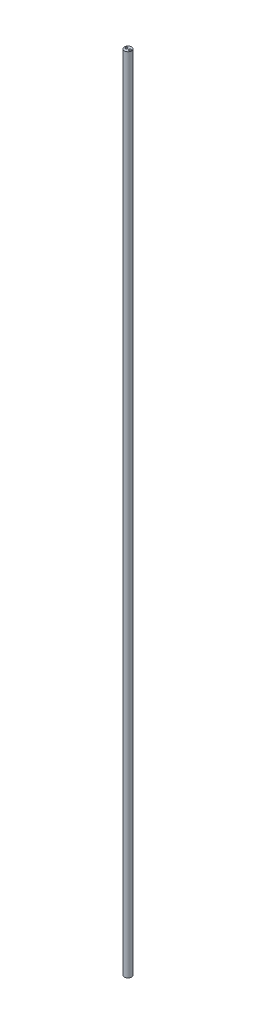
ISO-10303-21;
HEADER;
FILE_DESCRIPTION(('STEP AP214'),'2;1');
FILE_NAME('part.step','',(''),(''),'','','');
FILE_SCHEMA(('AUTOMOTIVE_DESIGN { 1 0 10303 214 1 1 1 1 }'));
ENDSEC;
DATA;
#1=APPLICATION_CONTEXT('core data for automotive mechanical design processes');
#2=APPLICATION_PROTOCOL_DEFINITION('international standard','automotive_design',2000,#1);
#3=PRODUCT_CONTEXT('',#1,'mechanical');
#4=PRODUCT('Part','Part','',(#3));
#5=PRODUCT_RELATED_PRODUCT_CATEGORY('part','',(#4));
#6=PRODUCT_DEFINITION_FORMATION('','',#4);
#7=PRODUCT_DEFINITION_CONTEXT('part definition',#1,'design');
#8=PRODUCT_DEFINITION('design','',#6,#7);
#9=PRODUCT_DEFINITION_SHAPE('','',#8);
#10=(LENGTH_UNIT() NAMED_UNIT(*) SI_UNIT(.MILLI.,.METRE.));
#11=(NAMED_UNIT(*) PLANE_ANGLE_UNIT() SI_UNIT($,.RADIAN.));
#12=(NAMED_UNIT(*) SI_UNIT($,.STERADIAN.) SOLID_ANGLE_UNIT());
#13=UNCERTAINTY_MEASURE_WITH_UNIT(LENGTH_MEASURE(1.E-05),#10,'distance_accuracy_value','');
#14=(GEOMETRIC_REPRESENTATION_CONTEXT(3) GLOBAL_UNCERTAINTY_ASSIGNED_CONTEXT((#13)) GLOBAL_UNIT_ASSIGNED_CONTEXT((#10,
#11,#12)) REPRESENTATION_CONTEXT('',''));
#15=CARTESIAN_POINT('',(0.,0.,0.));
#16=DIRECTION('',(0.,0.,1.));
#17=DIRECTION('',(1.,0.,0.));
#18=AXIS2_PLACEMENT_3D('',#15,#16,#17);
#19=CARTESIAN_POINT('',(0.,20.,0.));
#20=DIRECTION('',(0.,-1.,0.));
#21=DIRECTION('',(0.,0.,-1.));
#22=AXIS2_PLACEMENT_3D('',#19,#20,#21);
#23=CYLINDRICAL_SURFACE('',#22,0.088);
#24=CARTESIAN_POINT('',(0.,20.,0.));
#25=DIRECTION('',(0.,1.,0.));
#26=DIRECTION('',(0.,0.,1.));
#27=AXIS2_PLACEMENT_3D('',#24,#25,#26);
#28=CIRCLE('',#27,0.088);
#29=CARTESIAN_POINT('',(0.,20.,0.088));
#30=VERTEX_POINT('',#29);
#31=EDGE_CURVE('E56',#30,#30,#28,.T.);
#32=ORIENTED_EDGE('',*,*,#31,.F.);
#33=EDGE_LOOP('',(#32));
#34=FACE_BOUND('',#33,.T.);
#35=CARTESIAN_POINT('',(0.,0.,0.));
#36=DIRECTION('',(0.,1.,0.));
#37=DIRECTION('',(0.,0.,1.));
#38=AXIS2_PLACEMENT_3D('',#35,#36,#37);
#39=CIRCLE('',#38,0.088);
#40=CARTESIAN_POINT('',(0.,0.,0.088));
#41=VERTEX_POINT('',#40);
#42=EDGE_CURVE('E69',#41,#41,#39,.T.);
#43=ORIENTED_EDGE('',*,*,#42,.T.);
#44=EDGE_LOOP('',(#43));
#45=FACE_BOUND('',#44,.T.);
#46=ADVANCED_FACE('F47',(#34,#45),#23,.T.);
#47=CARTESIAN_POINT('',(-0.0367,20.,0.));
#48=DIRECTION('',(0.,-1.,0.));
#49=DIRECTION('',(0.,0.,-1.));
#50=AXIS2_PLACEMENT_3D('',#47,#48,#49);
#51=CYLINDRICAL_SURFACE('',#50,0.0288);
#52=CARTESIAN_POINT('',(-0.0367,20.,0.));
#53=DIRECTION('',(0.,1.,0.));
#54=DIRECTION('',(0.,0.,1.));
#55=AXIS2_PLACEMENT_3D('',#52,#53,#54);
#56=CIRCLE('',#55,0.0288);
#57=CARTESIAN_POINT('',(-0.0367,20.,0.0288));
#58=VERTEX_POINT('',#57);
#59=EDGE_CURVE('E62',#58,#58,#56,.T.);
#60=ORIENTED_EDGE('',*,*,#59,.T.);
#61=EDGE_LOOP('',(#60));
#62=FACE_BOUND('',#61,.T.);
#63=CARTESIAN_POINT('',(-0.0367,0.,0.));
#64=DIRECTION('',(0.,1.,0.));
#65=DIRECTION('',(0.,0.,1.));
#66=AXIS2_PLACEMENT_3D('',#63,#64,#65);
#67=CIRCLE('',#66,0.0288);
#68=CARTESIAN_POINT('',(-0.0367,0.,0.0288));
#69=VERTEX_POINT('',#68);
#70=EDGE_CURVE('E66',#69,#69,#67,.T.);
#71=ORIENTED_EDGE('',*,*,#70,.F.);
#72=EDGE_LOOP('',(#71));
#73=FACE_BOUND('',#72,.T.);
#74=ADVANCED_FACE('F49',(#62,#73),#51,.F.);
#75=CARTESIAN_POINT('',(0.04685,20.,0.));
#76=DIRECTION('',(0.,-1.,0.));
#77=DIRECTION('',(0.,0.,-1.));
#78=AXIS2_PLACEMENT_3D('',#75,#76,#77);
#79=CYLINDRICAL_SURFACE('',#78,0.029);
#80=CARTESIAN_POINT('',(0.04685,20.,0.));
#81=DIRECTION('',(0.,1.,0.));
#82=DIRECTION('',(0.,0.,1.));
#83=AXIS2_PLACEMENT_3D('',#80,#81,#82);
#84=CIRCLE('',#83,0.029);
#85=CARTESIAN_POINT('',(0.04685,20.,0.029));
#86=VERTEX_POINT('',#85);
#87=EDGE_CURVE('E10',#86,#86,#84,.T.);
#88=ORIENTED_EDGE('',*,*,#87,.T.);
#89=EDGE_LOOP('',(#88));
#90=FACE_BOUND('',#89,.T.);
#91=CARTESIAN_POINT('',(0.04685,0.,0.));
#92=DIRECTION('',(0.,1.,0.));
#93=DIRECTION('',(0.,0.,1.));
#94=AXIS2_PLACEMENT_3D('',#91,#92,#93);
#95=CIRCLE('',#94,0.029);
#96=CARTESIAN_POINT('',(0.04685,0.,0.029));
#97=VERTEX_POINT('',#96);
#98=EDGE_CURVE('E51',#97,#97,#95,.T.);
#99=ORIENTED_EDGE('',*,*,#98,.F.);
#100=EDGE_LOOP('',(#99));
#101=FACE_BOUND('',#100,.T.);
#102=ADVANCED_FACE('F88',(#90,#101),#79,.F.);
#103=CARTESIAN_POINT('',(0.,20.,0.));
#104=DIRECTION('',(0.,1.,0.));
#105=DIRECTION('',(0.,0.,1.));
#106=AXIS2_PLACEMENT_3D('',#103,#104,#105);
#107=PLANE('',#106);
#108=ORIENTED_EDGE('',*,*,#59,.F.);
#109=EDGE_LOOP('',(#108));
#110=FACE_BOUND('',#109,.T.);
#111=ORIENTED_EDGE('',*,*,#31,.T.);
#112=EDGE_LOOP('',(#111));
#113=FACE_BOUND('',#112,.T.);
#114=ORIENTED_EDGE('',*,*,#87,.F.);
#115=EDGE_LOOP('',(#114));
#116=FACE_BOUND('',#115,.T.);
#117=ADVANCED_FACE('F84',(#110,#113,#116),#107,.T.);
#118=CARTESIAN_POINT('',(0.,0.,0.));
#119=DIRECTION('',(0.,1.,0.));
#120=DIRECTION('',(0.,0.,1.));
#121=AXIS2_PLACEMENT_3D('',#118,#119,#120);
#122=PLANE('',#121);
#123=ORIENTED_EDGE('',*,*,#70,.T.);
#124=EDGE_LOOP('',(#123));
#125=FACE_BOUND('',#124,.T.);
#126=ORIENTED_EDGE('',*,*,#42,.F.);
#127=EDGE_LOOP('',(#126));
#128=FACE_BOUND('',#127,.T.);
#129=ORIENTED_EDGE('',*,*,#98,.T.);
#130=EDGE_LOOP('',(#129));
#131=FACE_BOUND('',#130,.T.);
#132=ADVANCED_FACE('F87',(#125,#128,#131),#122,.F.);
#133=CLOSED_SHELL('',(#46,#74,#102,#117,#132));
#134=MANIFOLD_SOLID_BREP('B2',#133);
#135=ADVANCED_BREP_SHAPE_REPRESENTATION('',(#18,#134),#14);
#136=SHAPE_DEFINITION_REPRESENTATION(#9,#135);
ENDSEC;
END-ISO-10303-21;
